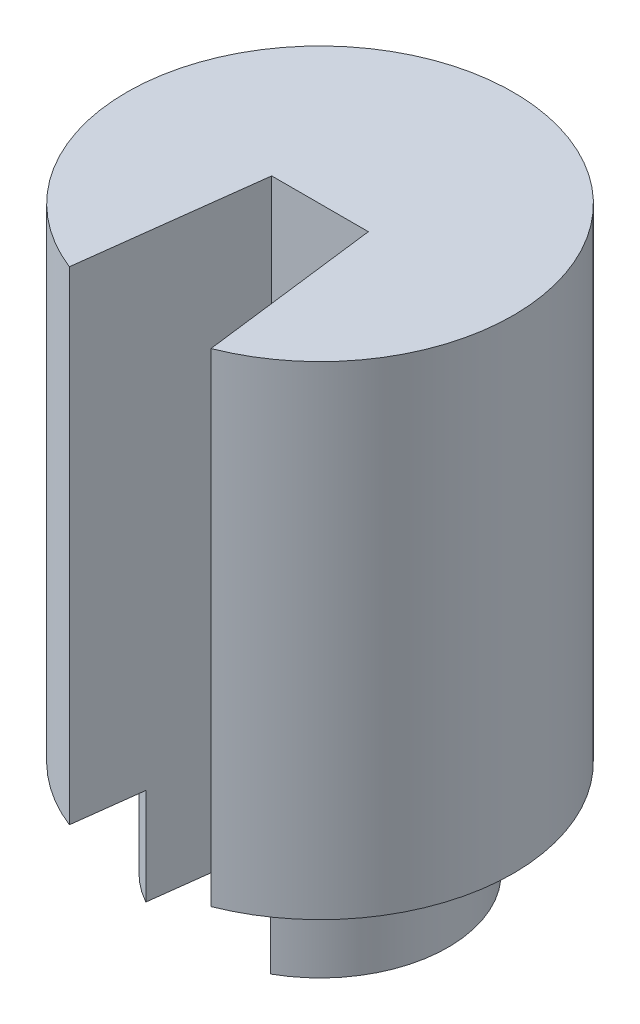
ISO-10303-21;
HEADER;
FILE_DESCRIPTION(('STEP AP214'),'2;1');
FILE_NAME('part.step','',(''),(''),'','','');
FILE_SCHEMA(('AUTOMOTIVE_DESIGN { 1 0 10303 214 1 1 1 1 }'));
ENDSEC;
DATA;
#1=APPLICATION_CONTEXT('core data for automotive mechanical design processes');
#2=APPLICATION_PROTOCOL_DEFINITION('international standard','automotive_design',2000,#1);
#3=PRODUCT_CONTEXT('',#1,'mechanical');
#4=PRODUCT('Part','Part','',(#3));
#5=PRODUCT_RELATED_PRODUCT_CATEGORY('part','',(#4));
#6=PRODUCT_DEFINITION_FORMATION('','',#4);
#7=PRODUCT_DEFINITION_CONTEXT('part definition',#1,'design');
#8=PRODUCT_DEFINITION('design','',#6,#7);
#9=PRODUCT_DEFINITION_SHAPE('','',#8);
#10=(LENGTH_UNIT() NAMED_UNIT(*) SI_UNIT(.MILLI.,.METRE.));
#11=(NAMED_UNIT(*) PLANE_ANGLE_UNIT() SI_UNIT($,.RADIAN.));
#12=(NAMED_UNIT(*) SI_UNIT($,.STERADIAN.) SOLID_ANGLE_UNIT());
#13=UNCERTAINTY_MEASURE_WITH_UNIT(LENGTH_MEASURE(1.E-05),#10,'distance_accuracy_value','');
#14=(GEOMETRIC_REPRESENTATION_CONTEXT(3) GLOBAL_UNCERTAINTY_ASSIGNED_CONTEXT((#13)) GLOBAL_UNIT_ASSIGNED_CONTEXT((#10,
#11,#12)) REPRESENTATION_CONTEXT('',''));
#15=CARTESIAN_POINT('',(0.,0.,0.));
#16=DIRECTION('',(0.,0.,1.));
#17=DIRECTION('',(1.,0.,0.));
#18=AXIS2_PLACEMENT_3D('',#15,#16,#17);
#19=CARTESIAN_POINT('',(0.,2.,0.));
#20=DIRECTION('',(0.,-1.,0.));
#21=DIRECTION('',(0.,0.,-1.));
#22=AXIS2_PLACEMENT_3D('',#19,#20,#21);
#23=CYLINDRICAL_SURFACE('',#22,2.65);
#24=CARTESIAN_POINT('',(0.,0.,0.));
#25=DIRECTION('',(0.,1.,0.));
#26=DIRECTION('',(0.,0.,1.));
#27=AXIS2_PLACEMENT_3D('',#24,#25,#26);
#28=CIRCLE('',#27,2.65);
#29=CARTESIAN_POINT('',(1.28939486644508,0.,2.31515893156065));
#30=VERTEX_POINT('',#29);
#31=CARTESIAN_POINT('',(-1.28939486644508,0.,2.31515893156065));
#32=VERTEX_POINT('',#31);
#33=EDGE_CURVE('E137',#30,#32,#28,.T.);
#34=ORIENTED_EDGE('',*,*,#33,.T.);
#35=DIRECTION('',(0.,-1.,0.));
#36=VECTOR('',#35,1.);
#37=CARTESIAN_POINT('',(-1.28939486644508,2.,2.31515893156065));
#38=LINE('',#37,#36);
#39=CARTESIAN_POINT('',(-1.28939486644508,2.,2.31515893156065));
#40=VERTEX_POINT('',#39);
#41=EDGE_CURVE('E82',#32,#40,#38,.F.);
#42=ORIENTED_EDGE('',*,*,#41,.T.);
#43=CARTESIAN_POINT('',(0.,2.,0.));
#44=DIRECTION('',(0.,1.,0.));
#45=DIRECTION('',(0.,0.,1.));
#46=AXIS2_PLACEMENT_3D('',#43,#44,#45);
#47=CIRCLE('',#46,2.65);
#48=CARTESIAN_POINT('',(1.28939486644508,2.,2.31515893156065));
#49=VERTEX_POINT('',#48);
#50=EDGE_CURVE('E208',#49,#40,#47,.T.);
#51=ORIENTED_EDGE('',*,*,#50,.F.);
#52=DIRECTION('',(0.,-1.,0.));
#53=VECTOR('',#52,1.);
#54=CARTESIAN_POINT('',(1.28939486644508,2.,2.31515893156065));
#55=LINE('',#54,#53);
#56=EDGE_CURVE('E74',#49,#30,#55,.T.);
#57=ORIENTED_EDGE('',*,*,#56,.T.);
#58=EDGE_LOOP('',(#34,#42,#51,#57));
#59=FACE_BOUND('',#58,.T.);
#60=ADVANCED_FACE('F56',(#59),#23,.T.);
#61=CARTESIAN_POINT('',(0.,0.,0.));
#62=DIRECTION('',(0.,1.,0.));
#63=DIRECTION('',(0.,0.,1.));
#64=AXIS2_PLACEMENT_3D('',#61,#62,#63);
#65=PLANE('',#64);
#66=DIRECTION('',(-1.,0.,0.));
#67=VECTOR('',#66,1.);
#68=CARTESIAN_POINT('',(0.,0.,0.));
#69=LINE('',#68,#67);
#70=CARTESIAN_POINT('',(1.,0.,0.));
#71=VERTEX_POINT('',#70);
#72=CARTESIAN_POINT('',(-1.,0.,0.));
#73=VERTEX_POINT('',#72);
#74=EDGE_CURVE('E112',#71,#73,#69,.T.);
#75=ORIENTED_EDGE('',*,*,#74,.T.);
#76=DIRECTION('',(-0.124034734589208,0.,0.992277876713668));
#77=VECTOR('',#76,1.);
#78=CARTESIAN_POINT('',(-0.984615384615385,0.,-0.123076923076923));
#79=LINE('',#78,#77);
#80=EDGE_CURVE('E124',#73,#32,#79,.T.);
#81=ORIENTED_EDGE('',*,*,#80,.T.);
#82=ORIENTED_EDGE('',*,*,#33,.F.);
#83=DIRECTION('',(-0.124034734589209,0.,-0.992277876713668));
#84=VECTOR('',#83,1.);
#85=CARTESIAN_POINT('',(0.984615384615385,0.,-0.123076923076923));
#86=LINE('',#85,#84);
#87=EDGE_CURVE('E128',#30,#71,#86,.T.);
#88=ORIENTED_EDGE('',*,*,#87,.T.);
#89=EDGE_LOOP('',(#75,#81,#82,#88));
#90=FACE_BOUND('',#89,.T.);
#91=ADVANCED_FACE('F135',(#90),#65,.F.);
#92=CARTESIAN_POINT('',(0.,12.,0.));
#93=DIRECTION('',(0.,-1.,0.));
#94=DIRECTION('',(0.,0.,-1.));
#95=AXIS2_PLACEMENT_3D('',#92,#93,#94);
#96=CYLINDRICAL_SURFACE('',#95,4.);
#97=CARTESIAN_POINT('',(0.,2.,0.));
#98=DIRECTION('',(0.,1.,0.));
#99=DIRECTION('',(0.,0.,1.));
#100=AXIS2_PLACEMENT_3D('',#97,#98,#99);
#101=CIRCLE('',#100,4.);
#102=CARTESIAN_POINT('',(1.46524613390195,2.,3.72196907121558));
#103=VERTEX_POINT('',#102);
#104=CARTESIAN_POINT('',(-1.46524613390195,2.,3.72196907121558));
#105=VERTEX_POINT('',#104);
#106=EDGE_CURVE('E123',#103,#105,#101,.T.);
#107=ORIENTED_EDGE('',*,*,#106,.T.);
#108=DIRECTION('',(0.,-1.,0.));
#109=VECTOR('',#108,1.);
#110=CARTESIAN_POINT('',(-1.46524613390195,12.,3.72196907121558));
#111=LINE('',#110,#109);
#112=CARTESIAN_POINT('',(-1.46524613390195,12.,3.72196907121558));
#113=VERTEX_POINT('',#112);
#114=EDGE_CURVE('E139',#105,#113,#111,.F.);
#115=ORIENTED_EDGE('',*,*,#114,.T.);
#116=CARTESIAN_POINT('',(0.,12.,0.));
#117=DIRECTION('',(0.,1.,0.));
#118=DIRECTION('',(0.,0.,1.));
#119=AXIS2_PLACEMENT_3D('',#116,#117,#118);
#120=CIRCLE('',#119,4.);
#121=CARTESIAN_POINT('',(1.46524613390195,12.,3.72196907121558));
#122=VERTEX_POINT('',#121);
#123=EDGE_CURVE('E197',#122,#113,#120,.T.);
#124=ORIENTED_EDGE('',*,*,#123,.F.);
#125=DIRECTION('',(0.,-1.,0.));
#126=VECTOR('',#125,1.);
#127=CARTESIAN_POINT('',(1.46524613390195,12.,3.72196907121558));
#128=LINE('',#127,#126);
#129=EDGE_CURVE('E194',#122,#103,#128,.T.);
#130=ORIENTED_EDGE('',*,*,#129,.T.);
#131=EDGE_LOOP('',(#107,#115,#124,#130));
#132=FACE_BOUND('',#131,.T.);
#133=ADVANCED_FACE('F237',(#132),#96,.T.);
#134=CARTESIAN_POINT('',(0.,12.,0.));
#135=DIRECTION('',(0.,1.,0.));
#136=DIRECTION('',(0.,0.,1.));
#137=AXIS2_PLACEMENT_3D('',#134,#135,#136);
#138=PLANE('',#137);
#139=DIRECTION('',(-0.124034734589208,0.,0.992277876713668));
#140=VECTOR('',#139,1.);
#141=CARTESIAN_POINT('',(-0.984615384615385,12.,-0.123076923076923));
#142=LINE('',#141,#140);
#143=CARTESIAN_POINT('',(-1.,12.,0.));
#144=VERTEX_POINT('',#143);
#145=EDGE_CURVE('E223',#144,#113,#142,.T.);
#146=ORIENTED_EDGE('',*,*,#145,.F.);
#147=DIRECTION('',(-1.,0.,0.));
#148=VECTOR('',#147,1.);
#149=CARTESIAN_POINT('',(0.,12.,0.));
#150=LINE('',#149,#148);
#151=CARTESIAN_POINT('',(1.,12.,0.));
#152=VERTEX_POINT('',#151);
#153=EDGE_CURVE('E12',#152,#144,#150,.T.);
#154=ORIENTED_EDGE('',*,*,#153,.F.);
#155=DIRECTION('',(-0.124034734589209,0.,-0.992277876713668));
#156=VECTOR('',#155,1.);
#157=CARTESIAN_POINT('',(0.984615384615385,12.,-0.123076923076923));
#158=LINE('',#157,#156);
#159=EDGE_CURVE('E130',#122,#152,#158,.T.);
#160=ORIENTED_EDGE('',*,*,#159,.F.);
#161=ORIENTED_EDGE('',*,*,#123,.T.);
#162=EDGE_LOOP('',(#146,#154,#160,#161));
#163=FACE_BOUND('',#162,.T.);
#164=ADVANCED_FACE('F177',(#163),#138,.T.);
#165=CARTESIAN_POINT('',(0.,2.,0.));
#166=DIRECTION('',(0.,1.,0.));
#167=DIRECTION('',(0.,0.,1.));
#168=AXIS2_PLACEMENT_3D('',#165,#166,#167);
#169=PLANE('',#168);
#170=ORIENTED_EDGE('',*,*,#50,.T.);
#171=DIRECTION('',(-0.124034734589208,0.,0.992277876713668));
#172=VECTOR('',#171,1.);
#173=CARTESIAN_POINT('',(-0.984615384615385,2.,-0.123076923076923));
#174=LINE('',#173,#172);
#175=EDGE_CURVE('E66',#40,#105,#174,.T.);
#176=ORIENTED_EDGE('',*,*,#175,.T.);
#177=ORIENTED_EDGE('',*,*,#106,.F.);
#178=DIRECTION('',(-0.124034734589209,0.,-0.992277876713668));
#179=VECTOR('',#178,1.);
#180=CARTESIAN_POINT('',(0.984615384615385,2.,-0.123076923076923));
#181=LINE('',#180,#179);
#182=EDGE_CURVE('E206',#103,#49,#181,.T.);
#183=ORIENTED_EDGE('',*,*,#182,.T.);
#184=EDGE_LOOP('',(#170,#176,#177,#183));
#185=FACE_BOUND('',#184,.T.);
#186=ADVANCED_FACE('F176',(#185),#169,.F.);
#187=CARTESIAN_POINT('',(0.,0.,0.));
#188=DIRECTION('',(0.,0.,-1.));
#189=DIRECTION('',(-1.,0.,0.));
#190=AXIS2_PLACEMENT_3D('',#187,#188,#189);
#191=PLANE('',#190);
#192=DIRECTION('',(0.,1.,0.));
#193=VECTOR('',#192,1.);
#194=CARTESIAN_POINT('',(1.,-12.2148313104913,0.));
#195=LINE('',#194,#193);
#196=EDGE_CURVE('E59',#71,#152,#195,.T.);
#197=ORIENTED_EDGE('',*,*,#196,.T.);
#198=ORIENTED_EDGE('',*,*,#153,.T.);
#199=DIRECTION('',(0.,-1.,0.));
#200=VECTOR('',#199,1.);
#201=CARTESIAN_POINT('',(-1.,-12.2148313104913,0.));
#202=LINE('',#201,#200);
#203=EDGE_CURVE('E118',#144,#73,#202,.T.);
#204=ORIENTED_EDGE('',*,*,#203,.T.);
#205=ORIENTED_EDGE('',*,*,#74,.F.);
#206=EDGE_LOOP('',(#197,#198,#204,#205));
#207=FACE_BOUND('',#206,.T.);
#208=ADVANCED_FACE('F114',(#207),#191,.F.);
#209=CARTESIAN_POINT('',(-0.984615384615385,0.,-0.123076923076923));
#210=DIRECTION('',(-0.992277876713668,0.,-0.124034734589208));
#211=DIRECTION('',(-0.124034734589208,0.,0.992277876713668));
#212=AXIS2_PLACEMENT_3D('',#209,#210,#211);
#213=PLANE('',#212);
#214=ORIENTED_EDGE('',*,*,#203,.F.);
#215=ORIENTED_EDGE('',*,*,#145,.T.);
#216=ORIENTED_EDGE('',*,*,#114,.F.);
#217=ORIENTED_EDGE('',*,*,#175,.F.);
#218=ORIENTED_EDGE('',*,*,#41,.F.);
#219=ORIENTED_EDGE('',*,*,#80,.F.);
#220=EDGE_LOOP('',(#214,#215,#216,#217,#218,#219));
#221=FACE_BOUND('',#220,.T.);
#222=ADVANCED_FACE('F162',(#221),#213,.F.);
#223=CARTESIAN_POINT('',(0.984615384615385,0.,-0.123076923076923));
#224=DIRECTION('',(0.992277876713668,0.,-0.124034734589209));
#225=DIRECTION('',(-0.124034734589209,0.,-0.992277876713668));
#226=AXIS2_PLACEMENT_3D('',#223,#224,#225);
#227=PLANE('',#226);
#228=ORIENTED_EDGE('',*,*,#56,.F.);
#229=ORIENTED_EDGE('',*,*,#182,.F.);
#230=ORIENTED_EDGE('',*,*,#129,.F.);
#231=ORIENTED_EDGE('',*,*,#159,.T.);
#232=ORIENTED_EDGE('',*,*,#196,.F.);
#233=ORIENTED_EDGE('',*,*,#87,.F.);
#234=EDGE_LOOP('',(#228,#229,#230,#231,#232,#233));
#235=FACE_BOUND('',#234,.T.);
#236=ADVANCED_FACE('F127',(#235),#227,.F.);
#237=CLOSED_SHELL('',(#60,#91,#133,#164,#186,#208,#222,#236));
#238=MANIFOLD_SOLID_BREP('B2',#237);
#239=ADVANCED_BREP_SHAPE_REPRESENTATION('',(#18,#238),#14);
#240=SHAPE_DEFINITION_REPRESENTATION(#9,#239);
ENDSEC;
END-ISO-10303-21;
